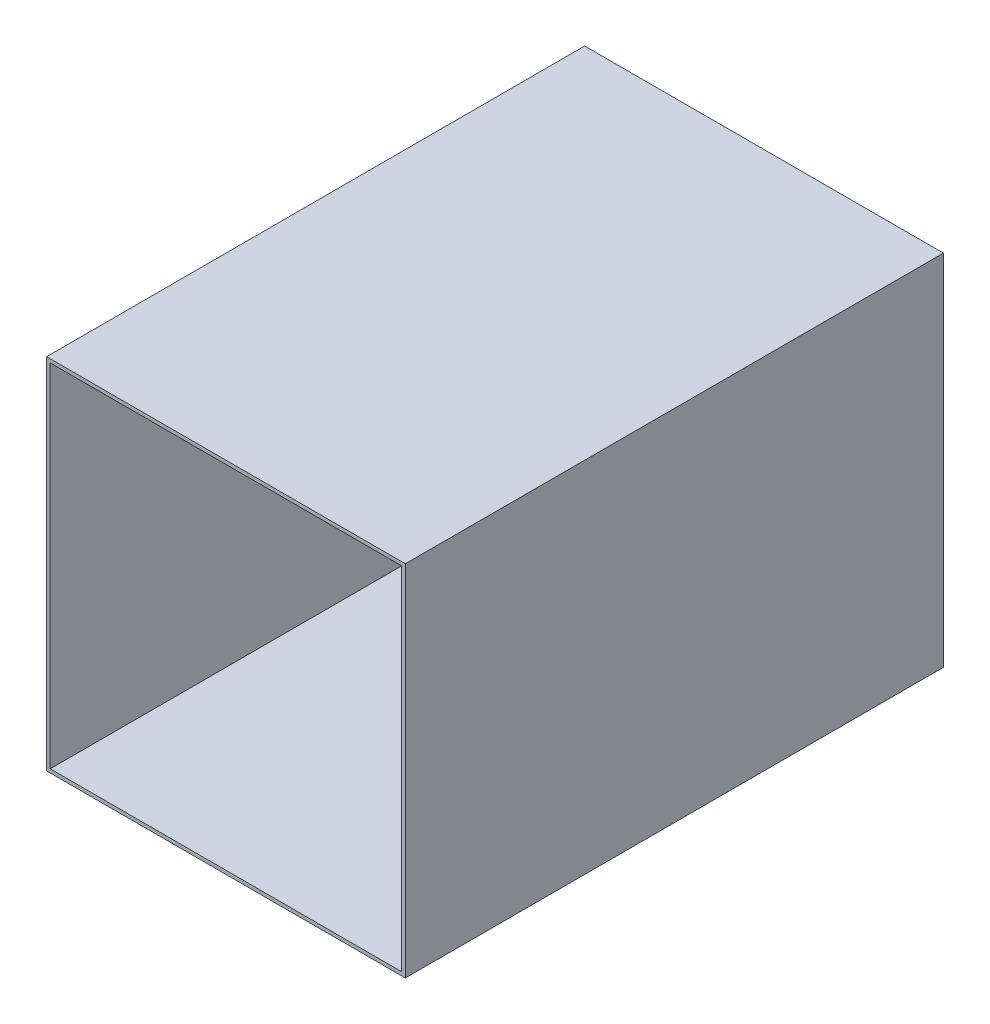
ISO-10303-21;
HEADER;
FILE_DESCRIPTION(('STEP AP214'),'2;1');
FILE_NAME('part.step','',(''),(''),'','','');
FILE_SCHEMA(('AUTOMOTIVE_DESIGN { 1 0 10303 214 1 1 1 1 }'));
ENDSEC;
DATA;
#1=APPLICATION_CONTEXT('core data for automotive mechanical design processes');
#2=APPLICATION_PROTOCOL_DEFINITION('international standard','automotive_design',2000,#1);
#3=PRODUCT_CONTEXT('',#1,'mechanical');
#4=PRODUCT('Part','Part','',(#3));
#5=PRODUCT_RELATED_PRODUCT_CATEGORY('part','',(#4));
#6=PRODUCT_DEFINITION_FORMATION('','',#4);
#7=PRODUCT_DEFINITION_CONTEXT('part definition',#1,'design');
#8=PRODUCT_DEFINITION('design','',#6,#7);
#9=PRODUCT_DEFINITION_SHAPE('','',#8);
#10=(LENGTH_UNIT() NAMED_UNIT(*) SI_UNIT(.MILLI.,.METRE.));
#11=(NAMED_UNIT(*) PLANE_ANGLE_UNIT() SI_UNIT($,.RADIAN.));
#12=(NAMED_UNIT(*) SI_UNIT($,.STERADIAN.) SOLID_ANGLE_UNIT());
#13=UNCERTAINTY_MEASURE_WITH_UNIT(LENGTH_MEASURE(1.E-05),#10,'distance_accuracy_value','');
#14=(GEOMETRIC_REPRESENTATION_CONTEXT(3) GLOBAL_UNCERTAINTY_ASSIGNED_CONTEXT((#13)) GLOBAL_UNIT_ASSIGNED_CONTEXT((#10,
#11,#12)) REPRESENTATION_CONTEXT('',''));
#15=CARTESIAN_POINT('',(0.,0.,0.));
#16=DIRECTION('',(0.,0.,1.));
#17=DIRECTION('',(1.,0.,0.));
#18=AXIS2_PLACEMENT_3D('',#15,#16,#17);
#19=CARTESIAN_POINT('',(0.,0.,150.));
#20=DIRECTION('',(0.,0.,-1.));
#21=DIRECTION('',(-1.,0.,0.));
#22=AXIS2_PLACEMENT_3D('',#19,#20,#21);
#23=PLANE('',#22);
#24=DIRECTION('',(0.,1.,0.));
#25=VECTOR('',#24,1.);
#26=CARTESIAN_POINT('',(100.,-100.,150.));
#27=LINE('',#26,#25);
#28=CARTESIAN_POINT('',(100.,-100.,150.));
#29=VERTEX_POINT('',#28);
#30=CARTESIAN_POINT('',(100.,100.,150.));
#31=VERTEX_POINT('',#30);
#32=EDGE_CURVE('E142',#29,#31,#27,.T.);
#33=ORIENTED_EDGE('',*,*,#32,.T.);
#34=DIRECTION('',(-1.,0.,0.));
#35=VECTOR('',#34,1.);
#36=CARTESIAN_POINT('',(-100.,100.,150.));
#37=LINE('',#36,#35);
#38=CARTESIAN_POINT('',(-100.,100.,150.));
#39=VERTEX_POINT('',#38);
#40=EDGE_CURVE('E144',#31,#39,#37,.T.);
#41=ORIENTED_EDGE('',*,*,#40,.T.);
#42=DIRECTION('',(0.,-1.,0.));
#43=VECTOR('',#42,1.);
#44=CARTESIAN_POINT('',(-100.,-100.,150.));
#45=LINE('',#44,#43);
#46=CARTESIAN_POINT('',(-100.,-100.,150.));
#47=VERTEX_POINT('',#46);
#48=EDGE_CURVE('E146',#39,#47,#45,.T.);
#49=ORIENTED_EDGE('',*,*,#48,.T.);
#50=DIRECTION('',(1.,0.,0.));
#51=VECTOR('',#50,1.);
#52=CARTESIAN_POINT('',(-100.,-100.,150.));
#53=LINE('',#52,#51);
#54=EDGE_CURVE('E147',#47,#29,#53,.T.);
#55=ORIENTED_EDGE('',*,*,#54,.T.);
#56=EDGE_LOOP('',(#33,#41,#49,#55));
#57=FACE_BOUND('',#56,.T.);
#58=DIRECTION('',(0.,1.,0.));
#59=VECTOR('',#58,1.);
#60=CARTESIAN_POINT('',(98.,98.,150.));
#61=LINE('',#60,#59);
#62=CARTESIAN_POINT('',(98.,-98.,150.));
#63=VERTEX_POINT('',#62);
#64=CARTESIAN_POINT('',(98.,98.,150.));
#65=VERTEX_POINT('',#64);
#66=EDGE_CURVE('E106',#63,#65,#61,.T.);
#67=ORIENTED_EDGE('',*,*,#66,.F.);
#68=DIRECTION('',(1.,0.,0.));
#69=VECTOR('',#68,1.);
#70=CARTESIAN_POINT('',(-98.,-98.,150.));
#71=LINE('',#70,#69);
#72=CARTESIAN_POINT('',(-98.,-98.,150.));
#73=VERTEX_POINT('',#72);
#74=EDGE_CURVE('E126',#73,#63,#71,.T.);
#75=ORIENTED_EDGE('',*,*,#74,.F.);
#76=DIRECTION('',(0.,-1.,0.));
#77=VECTOR('',#76,1.);
#78=CARTESIAN_POINT('',(-98.,98.,150.));
#79=LINE('',#78,#77);
#80=CARTESIAN_POINT('',(-98.,98.,150.));
#81=VERTEX_POINT('',#80);
#82=EDGE_CURVE('E127',#81,#73,#79,.T.);
#83=ORIENTED_EDGE('',*,*,#82,.F.);
#84=DIRECTION('',(-1.,0.,0.));
#85=VECTOR('',#84,1.);
#86=CARTESIAN_POINT('',(-98.,98.,150.));
#87=LINE('',#86,#85);
#88=EDGE_CURVE('E111',#65,#81,#87,.T.);
#89=ORIENTED_EDGE('',*,*,#88,.F.);
#90=EDGE_LOOP('',(#67,#75,#83,#89));
#91=FACE_BOUND('',#90,.T.);
#92=ADVANCED_FACE('F41',(#57,#91),#23,.F.);
#93=CARTESIAN_POINT('',(0.,0.,-150.));
#94=DIRECTION('',(0.,0.,-1.));
#95=DIRECTION('',(-1.,0.,0.));
#96=AXIS2_PLACEMENT_3D('',#93,#94,#95);
#97=PLANE('',#96);
#98=DIRECTION('',(0.,1.,0.));
#99=VECTOR('',#98,1.);
#100=CARTESIAN_POINT('',(100.,-100.,-150.));
#101=LINE('',#100,#99);
#102=CARTESIAN_POINT('',(100.,-100.,-150.));
#103=VERTEX_POINT('',#102);
#104=CARTESIAN_POINT('',(100.,100.,-150.));
#105=VERTEX_POINT('',#104);
#106=EDGE_CURVE('E122',#103,#105,#101,.T.);
#107=ORIENTED_EDGE('',*,*,#106,.F.);
#108=DIRECTION('',(1.,0.,0.));
#109=VECTOR('',#108,1.);
#110=CARTESIAN_POINT('',(-100.,-100.,-150.));
#111=LINE('',#110,#109);
#112=CARTESIAN_POINT('',(-100.,-100.,-150.));
#113=VERTEX_POINT('',#112);
#114=EDGE_CURVE('E148',#113,#103,#111,.T.);
#115=ORIENTED_EDGE('',*,*,#114,.F.);
#116=DIRECTION('',(0.,-1.,0.));
#117=VECTOR('',#116,1.);
#118=CARTESIAN_POINT('',(-100.,-100.,-150.));
#119=LINE('',#118,#117);
#120=CARTESIAN_POINT('',(-100.,100.,-150.));
#121=VERTEX_POINT('',#120);
#122=EDGE_CURVE('E160',#121,#113,#119,.T.);
#123=ORIENTED_EDGE('',*,*,#122,.F.);
#124=DIRECTION('',(-1.,0.,0.));
#125=VECTOR('',#124,1.);
#126=CARTESIAN_POINT('',(-100.,100.,-150.));
#127=LINE('',#126,#125);
#128=EDGE_CURVE('E154',#105,#121,#127,.T.);
#129=ORIENTED_EDGE('',*,*,#128,.F.);
#130=EDGE_LOOP('',(#107,#115,#123,#129));
#131=FACE_BOUND('',#130,.T.);
#132=DIRECTION('',(1.,0.,0.));
#133=VECTOR('',#132,1.);
#134=CARTESIAN_POINT('',(-98.,-98.,-150.));
#135=LINE('',#134,#133);
#136=CARTESIAN_POINT('',(-98.,-98.,-150.));
#137=VERTEX_POINT('',#136);
#138=CARTESIAN_POINT('',(98.,-98.,-150.));
#139=VERTEX_POINT('',#138);
#140=EDGE_CURVE('E113',#137,#139,#135,.T.);
#141=ORIENTED_EDGE('',*,*,#140,.T.);
#142=DIRECTION('',(0.,1.,0.));
#143=VECTOR('',#142,1.);
#144=CARTESIAN_POINT('',(98.,98.,-150.));
#145=LINE('',#144,#143);
#146=CARTESIAN_POINT('',(98.,98.,-150.));
#147=VERTEX_POINT('',#146);
#148=EDGE_CURVE('E65',#139,#147,#145,.T.);
#149=ORIENTED_EDGE('',*,*,#148,.T.);
#150=DIRECTION('',(-1.,0.,0.));
#151=VECTOR('',#150,1.);
#152=CARTESIAN_POINT('',(-98.,98.,-150.));
#153=LINE('',#152,#151);
#154=CARTESIAN_POINT('',(-98.,98.,-150.));
#155=VERTEX_POINT('',#154);
#156=EDGE_CURVE('E121',#147,#155,#153,.T.);
#157=ORIENTED_EDGE('',*,*,#156,.T.);
#158=DIRECTION('',(0.,-1.,0.));
#159=VECTOR('',#158,1.);
#160=CARTESIAN_POINT('',(-98.,98.,-150.));
#161=LINE('',#160,#159);
#162=EDGE_CURVE('E135',#155,#137,#161,.T.);
#163=ORIENTED_EDGE('',*,*,#162,.T.);
#164=EDGE_LOOP('',(#141,#149,#157,#163));
#165=FACE_BOUND('',#164,.T.);
#166=ADVANCED_FACE('F171',(#131,#165),#97,.T.);
#167=CARTESIAN_POINT('',(100.,-100.,150.));
#168=DIRECTION('',(-1.,0.,0.));
#169=DIRECTION('',(0.,0.,1.));
#170=AXIS2_PLACEMENT_3D('',#167,#168,#169);
#171=PLANE('',#170);
#172=ORIENTED_EDGE('',*,*,#106,.T.);
#173=DIRECTION('',(0.,0.,-1.));
#174=VECTOR('',#173,1.);
#175=CARTESIAN_POINT('',(100.,100.,150.));
#176=LINE('',#175,#174);
#177=EDGE_CURVE('E11',#31,#105,#176,.T.);
#178=ORIENTED_EDGE('',*,*,#177,.F.);
#179=ORIENTED_EDGE('',*,*,#32,.F.);
#180=DIRECTION('',(0.,0.,-1.));
#181=VECTOR('',#180,1.);
#182=CARTESIAN_POINT('',(100.,-100.,150.));
#183=LINE('',#182,#181);
#184=EDGE_CURVE('E155',#29,#103,#183,.T.);
#185=ORIENTED_EDGE('',*,*,#184,.T.);
#186=EDGE_LOOP('',(#172,#178,#179,#185));
#187=FACE_BOUND('',#186,.T.);
#188=ADVANCED_FACE('F43',(#187),#171,.F.);
#189=CARTESIAN_POINT('',(-100.,100.,150.));
#190=DIRECTION('',(0.,-1.,0.));
#191=DIRECTION('',(0.,0.,-1.));
#192=AXIS2_PLACEMENT_3D('',#189,#190,#191);
#193=PLANE('',#192);
#194=ORIENTED_EDGE('',*,*,#128,.T.);
#195=DIRECTION('',(0.,0.,-1.));
#196=VECTOR('',#195,1.);
#197=CARTESIAN_POINT('',(-100.,100.,150.));
#198=LINE('',#197,#196);
#199=EDGE_CURVE('E47',#39,#121,#198,.T.);
#200=ORIENTED_EDGE('',*,*,#199,.F.);
#201=ORIENTED_EDGE('',*,*,#40,.F.);
#202=ORIENTED_EDGE('',*,*,#177,.T.);
#203=EDGE_LOOP('',(#194,#200,#201,#202));
#204=FACE_BOUND('',#203,.T.);
#205=ADVANCED_FACE('F183',(#204),#193,.F.);
#206=CARTESIAN_POINT('',(-100.,-100.,150.));
#207=DIRECTION('',(1.,0.,0.));
#208=DIRECTION('',(0.,0.,-1.));
#209=AXIS2_PLACEMENT_3D('',#206,#207,#208);
#210=PLANE('',#209);
#211=ORIENTED_EDGE('',*,*,#122,.T.);
#212=DIRECTION('',(0.,0.,-1.));
#213=VECTOR('',#212,1.);
#214=CARTESIAN_POINT('',(-100.,-100.,150.));
#215=LINE('',#214,#213);
#216=EDGE_CURVE('E165',#47,#113,#215,.T.);
#217=ORIENTED_EDGE('',*,*,#216,.F.);
#218=ORIENTED_EDGE('',*,*,#48,.F.);
#219=ORIENTED_EDGE('',*,*,#199,.T.);
#220=EDGE_LOOP('',(#211,#217,#218,#219));
#221=FACE_BOUND('',#220,.T.);
#222=ADVANCED_FACE('F166',(#221),#210,.F.);
#223=CARTESIAN_POINT('',(-100.,-100.,150.));
#224=DIRECTION('',(0.,1.,0.));
#225=DIRECTION('',(0.,0.,1.));
#226=AXIS2_PLACEMENT_3D('',#223,#224,#225);
#227=PLANE('',#226);
#228=ORIENTED_EDGE('',*,*,#114,.T.);
#229=ORIENTED_EDGE('',*,*,#184,.F.);
#230=ORIENTED_EDGE('',*,*,#54,.F.);
#231=ORIENTED_EDGE('',*,*,#216,.T.);
#232=EDGE_LOOP('',(#228,#229,#230,#231));
#233=FACE_BOUND('',#232,.T.);
#234=ADVANCED_FACE('F178',(#233),#227,.F.);
#235=CARTESIAN_POINT('',(98.,98.,150.));
#236=DIRECTION('',(-1.,0.,0.));
#237=DIRECTION('',(0.,0.,1.));
#238=AXIS2_PLACEMENT_3D('',#235,#236,#237);
#239=PLANE('',#238);
#240=ORIENTED_EDGE('',*,*,#148,.F.);
#241=DIRECTION('',(0.,0.,-1.));
#242=VECTOR('',#241,1.);
#243=CARTESIAN_POINT('',(98.,-98.,150.));
#244=LINE('',#243,#242);
#245=EDGE_CURVE('E109',#63,#139,#244,.T.);
#246=ORIENTED_EDGE('',*,*,#245,.F.);
#247=ORIENTED_EDGE('',*,*,#66,.T.);
#248=DIRECTION('',(0.,0.,-1.));
#249=VECTOR('',#248,1.);
#250=CARTESIAN_POINT('',(98.,98.,150.));
#251=LINE('',#250,#249);
#252=EDGE_CURVE('E108',#65,#147,#251,.T.);
#253=ORIENTED_EDGE('',*,*,#252,.T.);
#254=EDGE_LOOP('',(#240,#246,#247,#253));
#255=FACE_BOUND('',#254,.T.);
#256=ADVANCED_FACE('F107',(#255),#239,.T.);
#257=CARTESIAN_POINT('',(-98.,98.,150.));
#258=DIRECTION('',(0.,-1.,0.));
#259=DIRECTION('',(0.,0.,-1.));
#260=AXIS2_PLACEMENT_3D('',#257,#258,#259);
#261=PLANE('',#260);
#262=ORIENTED_EDGE('',*,*,#156,.F.);
#263=ORIENTED_EDGE('',*,*,#252,.F.);
#264=ORIENTED_EDGE('',*,*,#88,.T.);
#265=DIRECTION('',(0.,0.,-1.));
#266=VECTOR('',#265,1.);
#267=CARTESIAN_POINT('',(-98.,98.,150.));
#268=LINE('',#267,#266);
#269=EDGE_CURVE('E124',#81,#155,#268,.T.);
#270=ORIENTED_EDGE('',*,*,#269,.T.);
#271=EDGE_LOOP('',(#262,#263,#264,#270));
#272=FACE_BOUND('',#271,.T.);
#273=ADVANCED_FACE('F117',(#272),#261,.T.);
#274=CARTESIAN_POINT('',(-98.,98.,150.));
#275=DIRECTION('',(1.,0.,0.));
#276=DIRECTION('',(0.,0.,-1.));
#277=AXIS2_PLACEMENT_3D('',#274,#275,#276);
#278=PLANE('',#277);
#279=ORIENTED_EDGE('',*,*,#162,.F.);
#280=ORIENTED_EDGE('',*,*,#269,.F.);
#281=ORIENTED_EDGE('',*,*,#82,.T.);
#282=DIRECTION('',(0.,0.,-1.));
#283=VECTOR('',#282,1.);
#284=CARTESIAN_POINT('',(-98.,-98.,150.));
#285=LINE('',#284,#283);
#286=EDGE_CURVE('E57',#73,#137,#285,.T.);
#287=ORIENTED_EDGE('',*,*,#286,.T.);
#288=EDGE_LOOP('',(#279,#280,#281,#287));
#289=FACE_BOUND('',#288,.T.);
#290=ADVANCED_FACE('F208',(#289),#278,.T.);
#291=CARTESIAN_POINT('',(-98.,-98.,150.));
#292=DIRECTION('',(0.,1.,0.));
#293=DIRECTION('',(0.,0.,1.));
#294=AXIS2_PLACEMENT_3D('',#291,#292,#293);
#295=PLANE('',#294);
#296=ORIENTED_EDGE('',*,*,#140,.F.);
#297=ORIENTED_EDGE('',*,*,#286,.F.);
#298=ORIENTED_EDGE('',*,*,#74,.T.);
#299=ORIENTED_EDGE('',*,*,#245,.T.);
#300=EDGE_LOOP('',(#296,#297,#298,#299));
#301=FACE_BOUND('',#300,.T.);
#302=ADVANCED_FACE('F215',(#301),#295,.T.);
#303=CLOSED_SHELL('',(#92,#166,#188,#205,#222,#234,#256,#273,#290,#302));
#304=MANIFOLD_SOLID_BREP('B2',#303);
#305=ADVANCED_BREP_SHAPE_REPRESENTATION('',(#18,#304),#14);
#306=SHAPE_DEFINITION_REPRESENTATION(#9,#305);
ENDSEC;
END-ISO-10303-21;
